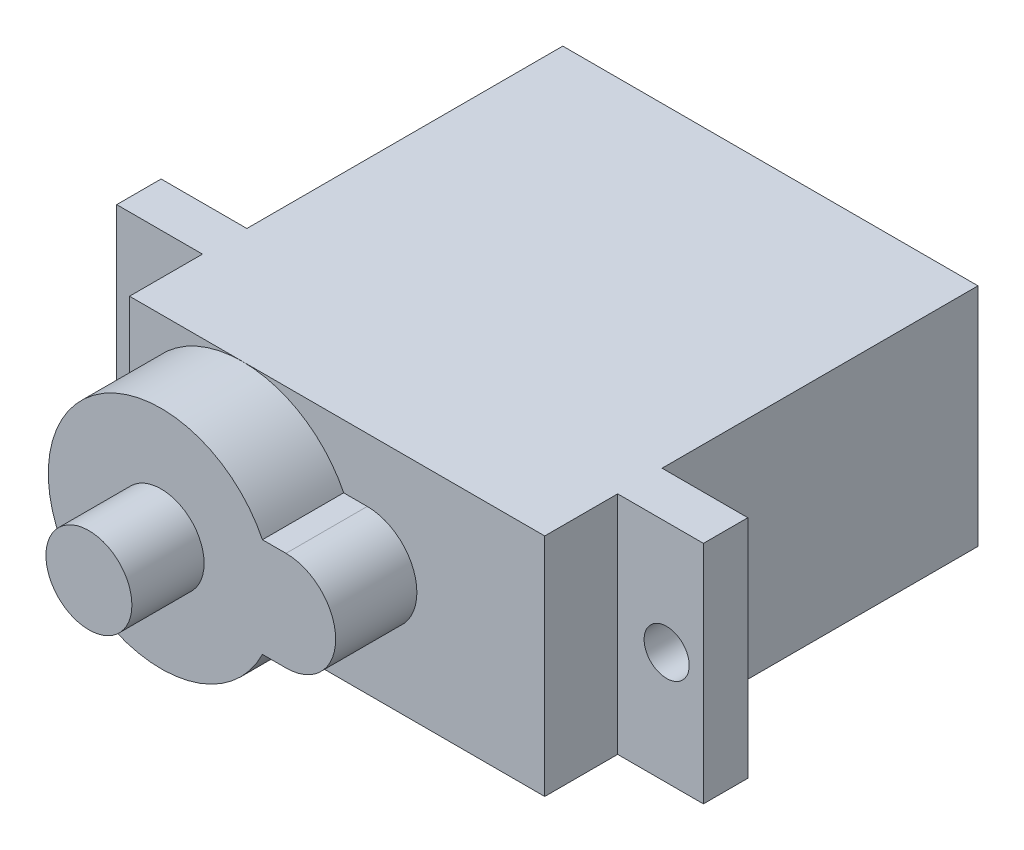
ISO-10303-21;
HEADER;
FILE_DESCRIPTION(('STEP AP214'),'2;1');
FILE_NAME('part.step','',(''),(''),'','','');
FILE_SCHEMA(('AUTOMOTIVE_DESIGN { 1 0 10303 214 1 1 1 1 }'));
ENDSEC;
DATA;
#1=APPLICATION_CONTEXT('core data for automotive mechanical design processes');
#2=APPLICATION_PROTOCOL_DEFINITION('international standard','automotive_design',2000,#1);
#3=PRODUCT_CONTEXT('',#1,'mechanical');
#4=PRODUCT('Part','Part','',(#3));
#5=PRODUCT_RELATED_PRODUCT_CATEGORY('part','',(#4));
#6=PRODUCT_DEFINITION_FORMATION('','',#4);
#7=PRODUCT_DEFINITION_CONTEXT('part definition',#1,'design');
#8=PRODUCT_DEFINITION('design','',#6,#7);
#9=PRODUCT_DEFINITION_SHAPE('','',#8);
#10=(LENGTH_UNIT() NAMED_UNIT(*) SI_UNIT(.MILLI.,.METRE.));
#11=(NAMED_UNIT(*) PLANE_ANGLE_UNIT() SI_UNIT($,.RADIAN.));
#12=(NAMED_UNIT(*) SI_UNIT($,.STERADIAN.) SOLID_ANGLE_UNIT());
#13=UNCERTAINTY_MEASURE_WITH_UNIT(LENGTH_MEASURE(1.E-05),#10,'distance_accuracy_value','');
#14=(GEOMETRIC_REPRESENTATION_CONTEXT(3) GLOBAL_UNCERTAINTY_ASSIGNED_CONTEXT((#13)) GLOBAL_UNIT_ASSIGNED_CONTEXT((#10,
#11,#12)) REPRESENTATION_CONTEXT('',''));
#15=CARTESIAN_POINT('',(0.,0.,0.));
#16=DIRECTION('',(0.,0.,1.));
#17=DIRECTION('',(1.,0.,0.));
#18=AXIS2_PLACEMENT_3D('',#15,#16,#17);
#19=CARTESIAN_POINT('',(0.,0.,24.));
#20=DIRECTION('',(0.,0.,1.));
#21=DIRECTION('',(1.,0.,0.));
#22=AXIS2_PLACEMENT_3D('',#19,#20,#21);
#23=PLANE('',#22);
#24=CARTESIAN_POINT('',(6.25,-6.25,24.));
#25=DIRECTION('',(0.,0.,1.));
#26=DIRECTION('',(1.,0.,0.));
#27=AXIS2_PLACEMENT_3D('',#24,#25,#26);
#28=CIRCLE('',#27,6.25);
#29=CARTESIAN_POINT('',(0.,-6.25,24.));
#30=VERTEX_POINT('',#29);
#31=CARTESIAN_POINT('',(6.25,-12.5,24.));
#32=VERTEX_POINT('',#31);
#33=EDGE_CURVE('E11',#30,#32,#28,.T.);
#34=ORIENTED_EDGE('',*,*,#33,.F.);
#35=DIRECTION('',(0.,-1.,0.));
#36=VECTOR('',#35,1.);
#37=CARTESIAN_POINT('',(0.,0.,24.));
#38=LINE('',#37,#36);
#39=CARTESIAN_POINT('',(0.,-12.5,24.));
#40=VERTEX_POINT('',#39);
#41=EDGE_CURVE('E242',#30,#40,#38,.T.);
#42=ORIENTED_EDGE('',*,*,#41,.T.);
#43=DIRECTION('',(1.,0.,0.));
#44=VECTOR('',#43,1.);
#45=CARTESIAN_POINT('',(0.,-12.5,24.));
#46=LINE('',#45,#44);
#47=EDGE_CURVE('E243',#40,#32,#46,.T.);
#48=ORIENTED_EDGE('',*,*,#47,.T.);
#49=EDGE_LOOP('',(#34,#42,#48));
#50=FACE_BOUND('',#49,.T.);
#51=ADVANCED_FACE('F39',(#50),#23,.T.);
#52=CARTESIAN_POINT('',(11.8624860801609,-9.,24.));
#53=VERTEX_POINT('',#52);
#54=EDGE_CURVE('E48',#32,#53,#28,.T.);
#55=ORIENTED_EDGE('',*,*,#54,.F.);
#56=CARTESIAN_POINT('',(23.,-12.5,24.));
#57=VERTEX_POINT('',#56);
#58=EDGE_CURVE('E241',#32,#57,#46,.T.);
#59=ORIENTED_EDGE('',*,*,#58,.T.);
#60=DIRECTION('',(0.,1.,0.));
#61=VECTOR('',#60,1.);
#62=CARTESIAN_POINT('',(23.,0.,24.));
#63=LINE('',#62,#61);
#64=CARTESIAN_POINT('',(23.,0.,24.));
#65=VERTEX_POINT('',#64);
#66=EDGE_CURVE('E246',#57,#65,#63,.T.);
#67=ORIENTED_EDGE('',*,*,#66,.T.);
#68=DIRECTION('',(-1.,0.,0.));
#69=VECTOR('',#68,1.);
#70=CARTESIAN_POINT('',(0.,0.,24.));
#71=LINE('',#70,#69);
#72=CARTESIAN_POINT('',(6.25,0.,24.));
#73=VERTEX_POINT('',#72);
#74=EDGE_CURVE('E249',#65,#73,#71,.T.);
#75=ORIENTED_EDGE('',*,*,#74,.T.);
#76=CARTESIAN_POINT('',(11.8624860801609,-3.5,24.));
#77=VERTEX_POINT('',#76);
#78=EDGE_CURVE('E50',#77,#73,#28,.T.);
#79=ORIENTED_EDGE('',*,*,#78,.F.);
#80=DIRECTION('',(-1.,0.,0.));
#81=VECTOR('',#80,1.);
#82=CARTESIAN_POINT('',(13.1677930330985,-3.5,24.));
#83=LINE('',#82,#81);
#84=CARTESIAN_POINT('',(13.1677930330985,-3.5,24.));
#85=VERTEX_POINT('',#84);
#86=EDGE_CURVE('E301',#85,#77,#83,.T.);
#87=ORIENTED_EDGE('',*,*,#86,.F.);
#88=CARTESIAN_POINT('',(13.1677930330985,-6.25,24.));
#89=DIRECTION('',(0.,0.,1.));
#90=DIRECTION('',(1.,0.,0.));
#91=AXIS2_PLACEMENT_3D('',#88,#89,#90);
#92=CIRCLE('',#91,2.75);
#93=CARTESIAN_POINT('',(13.1677930330985,-9.,24.));
#94=VERTEX_POINT('',#93);
#95=EDGE_CURVE('E62',#94,#85,#92,.T.);
#96=ORIENTED_EDGE('',*,*,#95,.F.);
#97=DIRECTION('',(1.,0.,0.));
#98=VECTOR('',#97,1.);
#99=CARTESIAN_POINT('',(13.1677930330985,-9.,24.));
#100=LINE('',#99,#98);
#101=EDGE_CURVE('E57',#53,#94,#100,.T.);
#102=ORIENTED_EDGE('',*,*,#101,.F.);
#103=EDGE_LOOP('',(#55,#59,#67,#75,#79,#87,#96,#102));
#104=FACE_BOUND('',#103,.T.);
#105=ADVANCED_FACE('F322',(#104),#23,.T.);
#106=CARTESIAN_POINT('',(0.,0.,24.));
#107=DIRECTION('',(1.,0.,0.));
#108=DIRECTION('',(0.,1.,0.));
#109=AXIS2_PLACEMENT_3D('',#106,#107,#108);
#110=PLANE('',#109);
#111=DIRECTION('',(0.,-1.,0.));
#112=VECTOR('',#111,1.);
#113=CARTESIAN_POINT('',(0.,0.,17.5));
#114=LINE('',#113,#112);
#115=CARTESIAN_POINT('',(0.,0.,17.5));
#116=VERTEX_POINT('',#115);
#117=CARTESIAN_POINT('',(0.,-12.5,17.5));
#118=VERTEX_POINT('',#117);
#119=EDGE_CURVE('E230',#116,#118,#114,.T.);
#120=ORIENTED_EDGE('',*,*,#119,.F.);
#121=DIRECTION('',(0.,0.,-1.));
#122=VECTOR('',#121,1.);
#123=CARTESIAN_POINT('',(0.,0.,24.));
#124=LINE('',#123,#122);
#125=CARTESIAN_POINT('',(0.,0.,0.));
#126=VERTEX_POINT('',#125);
#127=EDGE_CURVE('E252',#116,#126,#124,.T.);
#128=ORIENTED_EDGE('',*,*,#127,.T.);
#129=DIRECTION('',(0.,-1.,0.));
#130=VECTOR('',#129,1.);
#131=CARTESIAN_POINT('',(0.,0.,0.));
#132=LINE('',#131,#130);
#133=CARTESIAN_POINT('',(0.,-12.5,0.));
#134=VERTEX_POINT('',#133);
#135=EDGE_CURVE('E237',#126,#134,#132,.T.);
#136=ORIENTED_EDGE('',*,*,#135,.T.);
#137=DIRECTION('',(0.,0.,-1.));
#138=VECTOR('',#137,1.);
#139=CARTESIAN_POINT('',(0.,-12.5,24.));
#140=LINE('',#139,#138);
#141=EDGE_CURVE('E273',#118,#134,#140,.T.);
#142=ORIENTED_EDGE('',*,*,#141,.F.);
#143=EDGE_LOOP('',(#120,#128,#136,#142));
#144=FACE_BOUND('',#143,.T.);
#145=ADVANCED_FACE('F379',(#144),#110,.F.);
#146=CARTESIAN_POINT('',(23.,0.,24.));
#147=DIRECTION('',(-1.,0.,0.));
#148=DIRECTION('',(0.,0.,1.));
#149=AXIS2_PLACEMENT_3D('',#146,#147,#148);
#150=PLANE('',#149);
#151=DIRECTION('',(0.,1.,0.));
#152=VECTOR('',#151,1.);
#153=CARTESIAN_POINT('',(23.,0.,17.5));
#154=LINE('',#153,#152);
#155=CARTESIAN_POINT('',(23.,-12.5,17.5));
#156=VERTEX_POINT('',#155);
#157=CARTESIAN_POINT('',(23.,0.,17.5));
#158=VERTEX_POINT('',#157);
#159=EDGE_CURVE('E227',#156,#158,#154,.T.);
#160=ORIENTED_EDGE('',*,*,#159,.F.);
#161=DIRECTION('',(0.,0.,-1.));
#162=VECTOR('',#161,1.);
#163=CARTESIAN_POINT('',(23.,-12.5,24.));
#164=LINE('',#163,#162);
#165=CARTESIAN_POINT('',(23.,-12.5,0.));
#166=VERTEX_POINT('',#165);
#167=EDGE_CURVE('E270',#156,#166,#164,.T.);
#168=ORIENTED_EDGE('',*,*,#167,.T.);
#169=DIRECTION('',(0.,1.,0.));
#170=VECTOR('',#169,1.);
#171=CARTESIAN_POINT('',(23.,0.,0.));
#172=LINE('',#171,#170);
#173=CARTESIAN_POINT('',(23.,0.,0.));
#174=VERTEX_POINT('',#173);
#175=EDGE_CURVE('E258',#166,#174,#172,.T.);
#176=ORIENTED_EDGE('',*,*,#175,.T.);
#177=DIRECTION('',(0.,0.,-1.));
#178=VECTOR('',#177,1.);
#179=CARTESIAN_POINT('',(23.,0.,24.));
#180=LINE('',#179,#178);
#181=EDGE_CURVE('E266',#158,#174,#180,.T.);
#182=ORIENTED_EDGE('',*,*,#181,.F.);
#183=EDGE_LOOP('',(#160,#168,#176,#182));
#184=FACE_BOUND('',#183,.T.);
#185=ADVANCED_FACE('F345',(#184),#150,.F.);
#186=CARTESIAN_POINT('',(0.,0.,24.));
#187=VERTEX_POINT('',#186);
#188=CARTESIAN_POINT('',(0.,0.,19.96));
#189=VERTEX_POINT('',#188);
#190=EDGE_CURVE('E264',#187,#189,#124,.T.);
#191=ORIENTED_EDGE('',*,*,#190,.T.);
#192=DIRECTION('',(0.,-1.,0.));
#193=VECTOR('',#192,1.);
#194=CARTESIAN_POINT('',(0.,0.,19.96));
#195=LINE('',#194,#193);
#196=CARTESIAN_POINT('',(0.,-12.5,19.96));
#197=VERTEX_POINT('',#196);
#198=EDGE_CURVE('E235',#189,#197,#195,.T.);
#199=ORIENTED_EDGE('',*,*,#198,.T.);
#200=EDGE_CURVE('E274',#40,#197,#140,.T.);
#201=ORIENTED_EDGE('',*,*,#200,.F.);
#202=ORIENTED_EDGE('',*,*,#41,.F.);
#203=EDGE_CURVE('E238',#187,#30,#38,.T.);
#204=ORIENTED_EDGE('',*,*,#203,.F.);
#205=EDGE_LOOP('',(#191,#199,#201,#202,#204));
#206=FACE_BOUND('',#205,.T.);
#207=ADVANCED_FACE('F41',(#206),#110,.F.);
#208=CARTESIAN_POINT('',(0.,-12.5,24.));
#209=DIRECTION('',(0.,1.,0.));
#210=DIRECTION('',(0.,0.,1.));
#211=AXIS2_PLACEMENT_3D('',#208,#209,#210);
#212=PLANE('',#211);
#213=ORIENTED_EDGE('',*,*,#200,.T.);
#214=DIRECTION('',(1.,0.,0.));
#215=VECTOR('',#214,1.);
#216=CARTESIAN_POINT('',(-4.75,-12.5,19.96));
#217=LINE('',#216,#215);
#218=CARTESIAN_POINT('',(-4.75,-12.5,19.96));
#219=VERTEX_POINT('',#218);
#220=EDGE_CURVE('E198',#219,#197,#217,.T.);
#221=ORIENTED_EDGE('',*,*,#220,.F.);
#222=DIRECTION('',(0.,0.,-1.));
#223=VECTOR('',#222,1.);
#224=CARTESIAN_POINT('',(-4.75,-12.5,19.96));
#225=LINE('',#224,#223);
#226=CARTESIAN_POINT('',(-4.75,-12.5,17.5));
#227=VERTEX_POINT('',#226);
#228=EDGE_CURVE('E224',#219,#227,#225,.T.);
#229=ORIENTED_EDGE('',*,*,#228,.T.);
#230=DIRECTION('',(1.,0.,0.));
#231=VECTOR('',#230,1.);
#232=CARTESIAN_POINT('',(-4.75,-12.5,17.5));
#233=LINE('',#232,#231);
#234=EDGE_CURVE('E208',#227,#118,#233,.T.);
#235=ORIENTED_EDGE('',*,*,#234,.T.);
#236=ORIENTED_EDGE('',*,*,#141,.T.);
#237=DIRECTION('',(1.,0.,0.));
#238=VECTOR('',#237,1.);
#239=CARTESIAN_POINT('',(0.,-12.5,0.));
#240=LINE('',#239,#238);
#241=EDGE_CURVE('E255',#134,#166,#240,.T.);
#242=ORIENTED_EDGE('',*,*,#241,.T.);
#243=ORIENTED_EDGE('',*,*,#167,.F.);
#244=CARTESIAN_POINT('',(27.75,-12.5,17.5));
#245=VERTEX_POINT('',#244);
#246=EDGE_CURVE('E187',#156,#245,#233,.T.);
#247=ORIENTED_EDGE('',*,*,#246,.T.);
#248=DIRECTION('',(0.,0.,-1.));
#249=VECTOR('',#248,1.);
#250=CARTESIAN_POINT('',(27.75,-12.5,19.96));
#251=LINE('',#250,#249);
#252=CARTESIAN_POINT('',(27.75,-12.5,19.96));
#253=VERTEX_POINT('',#252);
#254=EDGE_CURVE('E221',#253,#245,#251,.T.);
#255=ORIENTED_EDGE('',*,*,#254,.F.);
#256=CARTESIAN_POINT('',(23.,-12.5,19.96));
#257=VERTEX_POINT('',#256);
#258=EDGE_CURVE('E196',#257,#253,#217,.T.);
#259=ORIENTED_EDGE('',*,*,#258,.F.);
#260=EDGE_CURVE('E271',#57,#257,#164,.T.);
#261=ORIENTED_EDGE('',*,*,#260,.F.);
#262=ORIENTED_EDGE('',*,*,#58,.F.);
#263=ORIENTED_EDGE('',*,*,#47,.F.);
#264=EDGE_LOOP('',(#213,#221,#229,#235,#236,#242,#243,#247,#255,#259,#261,#262,#263));
#265=FACE_BOUND('',#264,.T.);
#266=ADVANCED_FACE('F347',(#265),#212,.F.);
#267=ORIENTED_EDGE('',*,*,#260,.T.);
#268=DIRECTION('',(0.,1.,0.));
#269=VECTOR('',#268,1.);
#270=CARTESIAN_POINT('',(23.,0.,19.96));
#271=LINE('',#270,#269);
#272=CARTESIAN_POINT('',(23.,0.,19.96));
#273=VERTEX_POINT('',#272);
#274=EDGE_CURVE('E233',#257,#273,#271,.T.);
#275=ORIENTED_EDGE('',*,*,#274,.T.);
#276=EDGE_CURVE('E267',#65,#273,#180,.T.);
#277=ORIENTED_EDGE('',*,*,#276,.F.);
#278=ORIENTED_EDGE('',*,*,#66,.F.);
#279=EDGE_LOOP('',(#267,#275,#277,#278));
#280=FACE_BOUND('',#279,.T.);
#281=ADVANCED_FACE('F327',(#280),#150,.F.);
#282=CARTESIAN_POINT('',(0.,0.,24.));
#283=DIRECTION('',(0.,-1.,0.));
#284=DIRECTION('',(0.,0.,-1.));
#285=AXIS2_PLACEMENT_3D('',#282,#283,#284);
#286=PLANE('',#285);
#287=ORIENTED_EDGE('',*,*,#276,.T.);
#288=DIRECTION('',(-1.,0.,0.));
#289=VECTOR('',#288,1.);
#290=CARTESIAN_POINT('',(-4.75000000000001,0.,19.96));
#291=LINE('',#290,#289);
#292=CARTESIAN_POINT('',(27.75,0.,19.96));
#293=VERTEX_POINT('',#292);
#294=EDGE_CURVE('E204',#293,#273,#291,.T.);
#295=ORIENTED_EDGE('',*,*,#294,.F.);
#296=DIRECTION('',(0.,0.,-1.));
#297=VECTOR('',#296,1.);
#298=CARTESIAN_POINT('',(27.75,0.,19.96));
#299=LINE('',#298,#297);
#300=CARTESIAN_POINT('',(27.75,0.,17.5));
#301=VERTEX_POINT('',#300);
#302=EDGE_CURVE('E218',#293,#301,#299,.T.);
#303=ORIENTED_EDGE('',*,*,#302,.T.);
#304=DIRECTION('',(-1.,0.,0.));
#305=VECTOR('',#304,1.);
#306=CARTESIAN_POINT('',(-4.75000000000001,0.,17.5));
#307=LINE('',#306,#305);
#308=EDGE_CURVE('E197',#301,#158,#307,.T.);
#309=ORIENTED_EDGE('',*,*,#308,.T.);
#310=ORIENTED_EDGE('',*,*,#181,.T.);
#311=DIRECTION('',(-1.,0.,0.));
#312=VECTOR('',#311,1.);
#313=CARTESIAN_POINT('',(0.,0.,0.));
#314=LINE('',#313,#312);
#315=EDGE_CURVE('E261',#174,#126,#314,.T.);
#316=ORIENTED_EDGE('',*,*,#315,.T.);
#317=ORIENTED_EDGE('',*,*,#127,.F.);
#318=CARTESIAN_POINT('',(-4.75000000000001,0.,17.5));
#319=VERTEX_POINT('',#318);
#320=EDGE_CURVE('E213',#116,#319,#307,.T.);
#321=ORIENTED_EDGE('',*,*,#320,.T.);
#322=DIRECTION('',(0.,0.,-1.));
#323=VECTOR('',#322,1.);
#324=CARTESIAN_POINT('',(-4.75000000000001,0.,19.96));
#325=LINE('',#324,#323);
#326=CARTESIAN_POINT('',(-4.75000000000001,0.,19.96));
#327=VERTEX_POINT('',#326);
#328=EDGE_CURVE('E206',#327,#319,#325,.T.);
#329=ORIENTED_EDGE('',*,*,#328,.F.);
#330=EDGE_CURVE('E203',#189,#327,#291,.T.);
#331=ORIENTED_EDGE('',*,*,#330,.F.);
#332=ORIENTED_EDGE('',*,*,#190,.F.);
#333=EDGE_CURVE('E248',#73,#187,#71,.T.);
#334=ORIENTED_EDGE('',*,*,#333,.F.);
#335=ORIENTED_EDGE('',*,*,#74,.F.);
#336=EDGE_LOOP('',(#287,#295,#303,#309,#310,#316,#317,#321,#329,#331,#332,#334,#335));
#337=FACE_BOUND('',#336,.T.);
#338=ADVANCED_FACE('F320',(#337),#286,.F.);
#339=EDGE_CURVE('E276',#73,#30,#28,.T.);
#340=ORIENTED_EDGE('',*,*,#339,.F.);
#341=ORIENTED_EDGE('',*,*,#333,.T.);
#342=ORIENTED_EDGE('',*,*,#203,.T.);
#343=EDGE_LOOP('',(#340,#341,#342));
#344=FACE_BOUND('',#343,.T.);
#345=ADVANCED_FACE('F315',(#344),#23,.T.);
#346=CARTESIAN_POINT('',(0.,0.,0.));
#347=DIRECTION('',(0.,0.,1.));
#348=DIRECTION('',(1.,0.,0.));
#349=AXIS2_PLACEMENT_3D('',#346,#347,#348);
#350=PLANE('',#349);
#351=ORIENTED_EDGE('',*,*,#135,.F.);
#352=ORIENTED_EDGE('',*,*,#315,.F.);
#353=ORIENTED_EDGE('',*,*,#175,.F.);
#354=ORIENTED_EDGE('',*,*,#241,.F.);
#355=EDGE_LOOP('',(#351,#352,#353,#354));
#356=FACE_BOUND('',#355,.T.);
#357=ADVANCED_FACE('F353',(#356),#350,.F.);
#358=CARTESIAN_POINT('',(27.75,0.,19.96));
#359=DIRECTION('',(-1.,0.,0.));
#360=DIRECTION('',(0.,-1.,0.));
#361=AXIS2_PLACEMENT_3D('',#358,#359,#360);
#362=PLANE('',#361);
#363=DIRECTION('',(0.,1.,0.));
#364=VECTOR('',#363,1.);
#365=CARTESIAN_POINT('',(27.75,0.,17.5));
#366=LINE('',#365,#364);
#367=EDGE_CURVE('E211',#245,#301,#366,.T.);
#368=ORIENTED_EDGE('',*,*,#367,.T.);
#369=ORIENTED_EDGE('',*,*,#302,.F.);
#370=DIRECTION('',(0.,1.,0.));
#371=VECTOR('',#370,1.);
#372=CARTESIAN_POINT('',(27.75,0.,19.96));
#373=LINE('',#372,#371);
#374=EDGE_CURVE('E201',#253,#293,#373,.T.);
#375=ORIENTED_EDGE('',*,*,#374,.F.);
#376=ORIENTED_EDGE('',*,*,#254,.T.);
#377=EDGE_LOOP('',(#368,#369,#375,#376));
#378=FACE_BOUND('',#377,.T.);
#379=ADVANCED_FACE('F337',(#378),#362,.F.);
#380=CARTESIAN_POINT('',(0.,0.,19.96));
#381=DIRECTION('',(0.,0.,1.));
#382=DIRECTION('',(1.,0.,0.));
#383=AXIS2_PLACEMENT_3D('',#380,#381,#382);
#384=PLANE('',#383);
#385=CARTESIAN_POINT('',(25.7134675531805,-6.25,19.96));
#386=DIRECTION('',(0.,0.,1.));
#387=DIRECTION('',(1.,0.,0.));
#388=AXIS2_PLACEMENT_3D('',#385,#386,#387);
#389=CIRCLE('',#388,1.25);
#390=CARTESIAN_POINT('',(26.9634675531805,-6.25,19.96));
#391=VERTEX_POINT('',#390);
#392=EDGE_CURVE('E285',#391,#391,#389,.T.);
#393=ORIENTED_EDGE('',*,*,#392,.F.);
#394=EDGE_LOOP('',(#393));
#395=FACE_BOUND('',#394,.T.);
#396=ORIENTED_EDGE('',*,*,#274,.F.);
#397=ORIENTED_EDGE('',*,*,#258,.T.);
#398=ORIENTED_EDGE('',*,*,#374,.T.);
#399=ORIENTED_EDGE('',*,*,#294,.T.);
#400=EDGE_LOOP('',(#396,#397,#398,#399));
#401=FACE_BOUND('',#400,.T.);
#402=ADVANCED_FACE('F331',(#395,#401),#384,.T.);
#403=CARTESIAN_POINT('',(0.,0.,17.5));
#404=DIRECTION('',(0.,0.,1.));
#405=DIRECTION('',(1.,0.,0.));
#406=AXIS2_PLACEMENT_3D('',#403,#404,#405);
#407=PLANE('',#406);
#408=CARTESIAN_POINT('',(25.7134675531805,-6.25,17.5));
#409=DIRECTION('',(0.,0.,1.));
#410=DIRECTION('',(1.,0.,0.));
#411=AXIS2_PLACEMENT_3D('',#408,#409,#410);
#412=CIRCLE('',#411,1.25);
#413=CARTESIAN_POINT('',(26.9634675531805,-6.25,17.5));
#414=VERTEX_POINT('',#413);
#415=EDGE_CURVE('E43',#414,#414,#412,.T.);
#416=ORIENTED_EDGE('',*,*,#415,.T.);
#417=EDGE_LOOP('',(#416));
#418=FACE_BOUND('',#417,.T.);
#419=ORIENTED_EDGE('',*,*,#246,.F.);
#420=ORIENTED_EDGE('',*,*,#159,.T.);
#421=ORIENTED_EDGE('',*,*,#308,.F.);
#422=ORIENTED_EDGE('',*,*,#367,.F.);
#423=EDGE_LOOP('',(#419,#420,#421,#422));
#424=FACE_BOUND('',#423,.T.);
#425=ADVANCED_FACE('F342',(#418,#424),#407,.F.);
#426=CARTESIAN_POINT('',(-2.28653244681953,-6.25,19.96));
#427=DIRECTION('',(0.,0.,1.));
#428=DIRECTION('',(1.,0.,0.));
#429=AXIS2_PLACEMENT_3D('',#426,#427,#428);
#430=CIRCLE('',#429,1.25);
#431=CARTESIAN_POINT('',(-1.03653244681953,-6.25,19.96));
#432=VERTEX_POINT('',#431);
#433=EDGE_CURVE('E279',#432,#432,#430,.T.);
#434=ORIENTED_EDGE('',*,*,#433,.F.);
#435=EDGE_LOOP('',(#434));
#436=FACE_BOUND('',#435,.T.);
#437=ORIENTED_EDGE('',*,*,#198,.F.);
#438=ORIENTED_EDGE('',*,*,#330,.T.);
#439=DIRECTION('',(0.,-1.,0.));
#440=VECTOR('',#439,1.);
#441=CARTESIAN_POINT('',(-4.75000000000001,0.,19.96));
#442=LINE('',#441,#440);
#443=EDGE_CURVE('E193',#327,#219,#442,.T.);
#444=ORIENTED_EDGE('',*,*,#443,.T.);
#445=ORIENTED_EDGE('',*,*,#220,.T.);
#446=EDGE_LOOP('',(#437,#438,#444,#445));
#447=FACE_BOUND('',#446,.T.);
#448=ADVANCED_FACE('F367',(#436,#447),#384,.T.);
#449=CARTESIAN_POINT('',(-2.28653244681953,-6.25,17.5));
#450=DIRECTION('',(0.,0.,1.));
#451=DIRECTION('',(1.,0.,0.));
#452=AXIS2_PLACEMENT_3D('',#449,#450,#451);
#453=CIRCLE('',#452,1.25);
#454=CARTESIAN_POINT('',(-1.03653244681953,-6.25,17.5));
#455=VERTEX_POINT('',#454);
#456=EDGE_CURVE('E277',#455,#455,#453,.T.);
#457=ORIENTED_EDGE('',*,*,#456,.T.);
#458=EDGE_LOOP('',(#457));
#459=FACE_BOUND('',#458,.T.);
#460=ORIENTED_EDGE('',*,*,#320,.F.);
#461=ORIENTED_EDGE('',*,*,#119,.T.);
#462=ORIENTED_EDGE('',*,*,#234,.F.);
#463=DIRECTION('',(0.,-1.,0.));
#464=VECTOR('',#463,1.);
#465=CARTESIAN_POINT('',(-4.75000000000001,0.,17.5));
#466=LINE('',#465,#464);
#467=EDGE_CURVE('E184',#319,#227,#466,.T.);
#468=ORIENTED_EDGE('',*,*,#467,.F.);
#469=EDGE_LOOP('',(#460,#461,#462,#468));
#470=FACE_BOUND('',#469,.T.);
#471=ADVANCED_FACE('F360',(#459,#470),#407,.F.);
#472=CARTESIAN_POINT('',(-4.75000000000001,0.,19.96));
#473=DIRECTION('',(1.,0.,0.));
#474=DIRECTION('',(0.,1.,0.));
#475=AXIS2_PLACEMENT_3D('',#472,#473,#474);
#476=PLANE('',#475);
#477=ORIENTED_EDGE('',*,*,#467,.T.);
#478=ORIENTED_EDGE('',*,*,#228,.F.);
#479=ORIENTED_EDGE('',*,*,#443,.F.);
#480=ORIENTED_EDGE('',*,*,#328,.T.);
#481=EDGE_LOOP('',(#477,#478,#479,#480));
#482=FACE_BOUND('',#481,.T.);
#483=ADVANCED_FACE('F363',(#482),#476,.F.);
#484=CARTESIAN_POINT('',(13.1677930330985,-6.25,28.5));
#485=DIRECTION('',(0.,0.,-1.));
#486=DIRECTION('',(-1.,0.,0.));
#487=AXIS2_PLACEMENT_3D('',#484,#485,#486);
#488=CYLINDRICAL_SURFACE('',#487,2.75);
#489=ORIENTED_EDGE('',*,*,#95,.T.);
#490=DIRECTION('',(0.,0.,-1.));
#491=VECTOR('',#490,1.);
#492=CARTESIAN_POINT('',(13.1677930330985,-3.5,28.5));
#493=LINE('',#492,#491);
#494=CARTESIAN_POINT('',(13.1677930330985,-3.5,28.5));
#495=VERTEX_POINT('',#494);
#496=EDGE_CURVE('E167',#495,#85,#493,.T.);
#497=ORIENTED_EDGE('',*,*,#496,.F.);
#498=CARTESIAN_POINT('',(13.1677930330985,-6.25,28.5));
#499=DIRECTION('',(0.,0.,1.));
#500=DIRECTION('',(1.,0.,0.));
#501=AXIS2_PLACEMENT_3D('',#498,#499,#500);
#502=CIRCLE('',#501,2.75);
#503=CARTESIAN_POINT('',(13.1677930330985,-9.,28.5));
#504=VERTEX_POINT('',#503);
#505=EDGE_CURVE('E173',#504,#495,#502,.T.);
#506=ORIENTED_EDGE('',*,*,#505,.F.);
#507=DIRECTION('',(0.,0.,-1.));
#508=VECTOR('',#507,1.);
#509=CARTESIAN_POINT('',(13.1677930330985,-9.,28.5));
#510=LINE('',#509,#508);
#511=EDGE_CURVE('E299',#504,#94,#510,.T.);
#512=ORIENTED_EDGE('',*,*,#511,.T.);
#513=EDGE_LOOP('',(#489,#497,#506,#512));
#514=FACE_BOUND('',#513,.T.);
#515=ADVANCED_FACE('F183',(#514),#488,.T.);
#516=CARTESIAN_POINT('',(13.1677930330985,-3.5,28.5));
#517=DIRECTION('',(0.,-1.,0.));
#518=DIRECTION('',(0.,0.,-1.));
#519=AXIS2_PLACEMENT_3D('',#516,#517,#518);
#520=PLANE('',#519);
#521=ORIENTED_EDGE('',*,*,#86,.T.);
#522=DIRECTION('',(0.,0.,-1.));
#523=VECTOR('',#522,1.);
#524=CARTESIAN_POINT('',(11.8624860801609,-3.5,28.5));
#525=LINE('',#524,#523);
#526=CARTESIAN_POINT('',(11.8624860801609,-3.5,28.5));
#527=VERTEX_POINT('',#526);
#528=EDGE_CURVE('E169',#527,#77,#525,.T.);
#529=ORIENTED_EDGE('',*,*,#528,.F.);
#530=DIRECTION('',(-1.,0.,0.));
#531=VECTOR('',#530,1.);
#532=CARTESIAN_POINT('',(13.1677930330985,-3.5,28.5));
#533=LINE('',#532,#531);
#534=EDGE_CURVE('E162',#495,#527,#533,.T.);
#535=ORIENTED_EDGE('',*,*,#534,.F.);
#536=ORIENTED_EDGE('',*,*,#496,.T.);
#537=EDGE_LOOP('',(#521,#529,#535,#536));
#538=FACE_BOUND('',#537,.T.);
#539=ADVANCED_FACE('F165',(#538),#520,.F.);
#540=CARTESIAN_POINT('',(6.25,-6.25,28.5));
#541=DIRECTION('',(0.,0.,-1.));
#542=DIRECTION('',(-1.,0.,0.));
#543=AXIS2_PLACEMENT_3D('',#540,#541,#542);
#544=CYLINDRICAL_SURFACE('',#543,6.25);
#545=ORIENTED_EDGE('',*,*,#78,.T.);
#546=ORIENTED_EDGE('',*,*,#339,.T.);
#547=ORIENTED_EDGE('',*,*,#33,.T.);
#548=ORIENTED_EDGE('',*,*,#54,.T.);
#549=DIRECTION('',(0.,0.,-1.));
#550=VECTOR('',#549,1.);
#551=CARTESIAN_POINT('',(11.8624860801609,-9.,28.5));
#552=LINE('',#551,#550);
#553=CARTESIAN_POINT('',(11.8624860801609,-9.,28.5));
#554=VERTEX_POINT('',#553);
#555=EDGE_CURVE('E189',#554,#53,#552,.T.);
#556=ORIENTED_EDGE('',*,*,#555,.F.);
#557=CARTESIAN_POINT('',(6.25,-6.25,28.5));
#558=DIRECTION('',(0.,0.,1.));
#559=DIRECTION('',(1.,0.,0.));
#560=AXIS2_PLACEMENT_3D('',#557,#558,#559);
#561=CIRCLE('',#560,6.25);
#562=EDGE_CURVE('E172',#527,#554,#561,.T.);
#563=ORIENTED_EDGE('',*,*,#562,.F.);
#564=ORIENTED_EDGE('',*,*,#528,.T.);
#565=EDGE_LOOP('',(#545,#546,#547,#548,#556,#563,#564));
#566=FACE_BOUND('',#565,.T.);
#567=ADVANCED_FACE('F310',(#566),#544,.T.);
#568=CARTESIAN_POINT('',(13.1677930330985,-9.,28.5));
#569=DIRECTION('',(0.,1.,0.));
#570=DIRECTION('',(0.,0.,1.));
#571=AXIS2_PLACEMENT_3D('',#568,#569,#570);
#572=PLANE('',#571);
#573=ORIENTED_EDGE('',*,*,#101,.T.);
#574=ORIENTED_EDGE('',*,*,#511,.F.);
#575=DIRECTION('',(1.,0.,0.));
#576=VECTOR('',#575,1.);
#577=CARTESIAN_POINT('',(13.1677930330985,-9.,28.5));
#578=LINE('',#577,#576);
#579=EDGE_CURVE('E178',#554,#504,#578,.T.);
#580=ORIENTED_EDGE('',*,*,#579,.F.);
#581=ORIENTED_EDGE('',*,*,#555,.T.);
#582=EDGE_LOOP('',(#573,#574,#580,#581));
#583=FACE_BOUND('',#582,.T.);
#584=ADVANCED_FACE('F308',(#583),#572,.F.);
#585=CARTESIAN_POINT('',(13.1677930330985,-6.25,28.5));
#586=DIRECTION('',(0.,0.,1.));
#587=DIRECTION('',(1.,0.,0.));
#588=AXIS2_PLACEMENT_3D('',#585,#586,#587);
#589=PLANE('',#588);
#590=CARTESIAN_POINT('',(6.25,-6.25,28.5));
#591=DIRECTION('',(0.,0.,1.));
#592=DIRECTION('',(1.,0.,0.));
#593=AXIS2_PLACEMENT_3D('',#590,#591,#592);
#594=CIRCLE('',#593,2.38123218163962);
#595=CARTESIAN_POINT('',(8.63123218163962,-6.25,28.5));
#596=VERTEX_POINT('',#595);
#597=EDGE_CURVE('E283',#596,#596,#594,.T.);
#598=ORIENTED_EDGE('',*,*,#597,.F.);
#599=EDGE_LOOP('',(#598));
#600=FACE_BOUND('',#599,.T.);
#601=ORIENTED_EDGE('',*,*,#505,.T.);
#602=ORIENTED_EDGE('',*,*,#534,.T.);
#603=ORIENTED_EDGE('',*,*,#562,.T.);
#604=ORIENTED_EDGE('',*,*,#579,.T.);
#605=EDGE_LOOP('',(#601,#602,#603,#604));
#606=FACE_BOUND('',#605,.T.);
#607=ADVANCED_FACE('F176',(#600,#606),#589,.T.);
#608=CARTESIAN_POINT('',(6.25,-6.25,32.5));
#609=DIRECTION('',(0.,0.,-1.));
#610=DIRECTION('',(-1.,0.,0.));
#611=AXIS2_PLACEMENT_3D('',#608,#609,#610);
#612=CYLINDRICAL_SURFACE('',#611,2.38123218163962);
#613=CARTESIAN_POINT('',(6.25,-6.25,32.5));
#614=DIRECTION('',(0.,0.,1.));
#615=DIRECTION('',(1.,0.,0.));
#616=AXIS2_PLACEMENT_3D('',#613,#614,#615);
#617=CIRCLE('',#616,2.38123218163962);
#618=CARTESIAN_POINT('',(8.63123218163962,-6.25,32.5));
#619=VERTEX_POINT('',#618);
#620=EDGE_CURVE('E292',#619,#619,#617,.T.);
#621=ORIENTED_EDGE('',*,*,#620,.F.);
#622=EDGE_LOOP('',(#621));
#623=FACE_BOUND('',#622,.T.);
#624=ORIENTED_EDGE('',*,*,#597,.T.);
#625=EDGE_LOOP('',(#624));
#626=FACE_BOUND('',#625,.T.);
#627=ADVANCED_FACE('F467',(#623,#626),#612,.T.);
#628=CARTESIAN_POINT('',(6.25,-6.25,32.5));
#629=DIRECTION('',(0.,0.,1.));
#630=DIRECTION('',(1.,0.,0.));
#631=AXIS2_PLACEMENT_3D('',#628,#629,#630);
#632=PLANE('',#631);
#633=ORIENTED_EDGE('',*,*,#620,.T.);
#634=EDGE_LOOP('',(#633));
#635=FACE_BOUND('',#634,.T.);
#636=ADVANCED_FACE('F475',(#635),#632,.T.);
#637=CARTESIAN_POINT('',(-2.28653244681953,-6.25,0.));
#638=DIRECTION('',(0.,0.,1.));
#639=DIRECTION('',(1.,0.,0.));
#640=AXIS2_PLACEMENT_3D('',#637,#638,#639);
#641=CYLINDRICAL_SURFACE('',#640,1.25);
#642=ORIENTED_EDGE('',*,*,#433,.T.);
#643=EDGE_LOOP('',(#642));
#644=FACE_BOUND('',#643,.T.);
#645=ORIENTED_EDGE('',*,*,#456,.F.);
#646=EDGE_LOOP('',(#645));
#647=FACE_BOUND('',#646,.T.);
#648=ADVANCED_FACE('F483',(#644,#647),#641,.F.);
#649=CARTESIAN_POINT('',(25.7134675531805,-6.25,0.));
#650=DIRECTION('',(0.,0.,1.));
#651=DIRECTION('',(1.,0.,0.));
#652=AXIS2_PLACEMENT_3D('',#649,#650,#651);
#653=CYLINDRICAL_SURFACE('',#652,1.25);
#654=ORIENTED_EDGE('',*,*,#392,.T.);
#655=EDGE_LOOP('',(#654));
#656=FACE_BOUND('',#655,.T.);
#657=ORIENTED_EDGE('',*,*,#415,.F.);
#658=EDGE_LOOP('',(#657));
#659=FACE_BOUND('',#658,.T.);
#660=ADVANCED_FACE('F492',(#656,#659),#653,.F.);
#661=CLOSED_SHELL('',(#51,#105,#145,#185,#207,#266,#281,#338,#345,#357,#379,#402,#425,#448,#471,
#483,#515,#539,#567,#584,#607,#627,#636,#648,#660));
#662=MANIFOLD_SOLID_BREP('B2',#661);
#663=ADVANCED_BREP_SHAPE_REPRESENTATION('',(#18,#662),#14);
#664=SHAPE_DEFINITION_REPRESENTATION(#9,#663);
ENDSEC;
END-ISO-10303-21;
